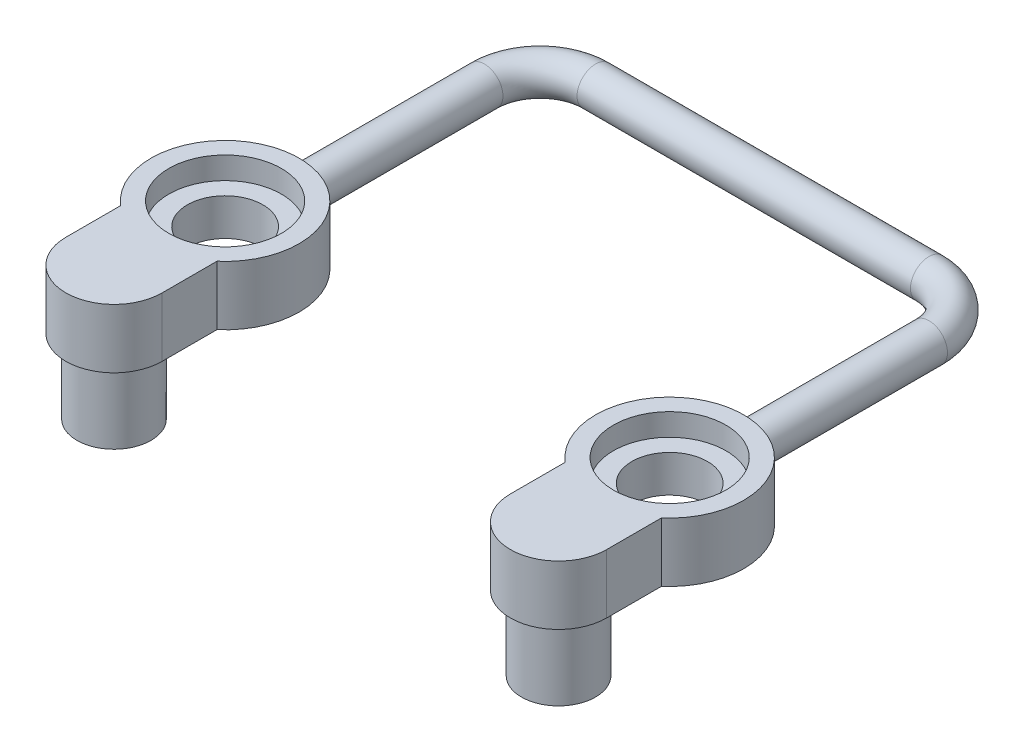
ISO-10303-21;
HEADER;
FILE_DESCRIPTION(('STEP AP214'),'2;1');
FILE_NAME('part.step','',(''),(''),'','','');
FILE_SCHEMA(('AUTOMOTIVE_DESIGN { 1 0 10303 214 1 1 1 1 }'));
ENDSEC;
DATA;
#1=APPLICATION_CONTEXT('core data for automotive mechanical design processes');
#2=APPLICATION_PROTOCOL_DEFINITION('international standard','automotive_design',2000,#1);
#3=PRODUCT_CONTEXT('',#1,'mechanical');
#4=PRODUCT('Part','Part','',(#3));
#5=PRODUCT_RELATED_PRODUCT_CATEGORY('part','',(#4));
#6=PRODUCT_DEFINITION_FORMATION('','',#4);
#7=PRODUCT_DEFINITION_CONTEXT('part definition',#1,'design');
#8=PRODUCT_DEFINITION('design','',#6,#7);
#9=PRODUCT_DEFINITION_SHAPE('','',#8);
#10=(LENGTH_UNIT() NAMED_UNIT(*) SI_UNIT(.MILLI.,.METRE.));
#11=(NAMED_UNIT(*) PLANE_ANGLE_UNIT() SI_UNIT($,.RADIAN.));
#12=(NAMED_UNIT(*) SI_UNIT($,.STERADIAN.) SOLID_ANGLE_UNIT());
#13=UNCERTAINTY_MEASURE_WITH_UNIT(LENGTH_MEASURE(1.E-05),#10,'distance_accuracy_value','');
#14=(GEOMETRIC_REPRESENTATION_CONTEXT(3) GLOBAL_UNCERTAINTY_ASSIGNED_CONTEXT((#13)) GLOBAL_UNIT_ASSIGNED_CONTEXT((#10,
#11,#12)) REPRESENTATION_CONTEXT('',''));
#15=CARTESIAN_POINT('',(0.,0.,0.));
#16=DIRECTION('',(0.,0.,1.));
#17=DIRECTION('',(1.,0.,0.));
#18=AXIS2_PLACEMENT_3D('',#15,#16,#17);
#19=CARTESIAN_POINT('',(38.1,0.,-12.192));
#20=DIRECTION('',(0.,0.,-1.));
#21=DIRECTION('',(-1.,0.,0.));
#22=AXIS2_PLACEMENT_3D('',#19,#20,#21);
#23=CYLINDRICAL_SURFACE('',#22,3.175);
#24=CARTESIAN_POINT('',(38.1,0.,-44.4499999999999));
#25=DIRECTION('',(0.,0.,1.));
#26=DIRECTION('',(1.,0.,0.));
#27=AXIS2_PLACEMENT_3D('',#24,#25,#26);
#28=CIRCLE('',#27,3.175);
#29=CARTESIAN_POINT('',(41.2749999999999,0.,-44.4499999999999));
#30=VERTEX_POINT('',#29);
#31=EDGE_CURVE('E184',#30,#30,#28,.T.);
#32=ORIENTED_EDGE('',*,*,#31,.T.);
#33=EDGE_LOOP('',(#32));
#34=FACE_BOUND('',#33,.T.);
#35=CARTESIAN_POINT('',(34.925,0.,-12.2967221242085));
#36=CARTESIAN_POINT('',(34.9250049801868,-0.175324453676753,-12.2967254711158));
#37=CARTESIAN_POINT('',(34.939571668218,-0.350704021321723,-12.3005126863854));
#38=CARTESIAN_POINT('',(34.997360630661,-0.696426824280357,-12.3152136473056));
#39=CARTESIAN_POINT('',(35.0405995824375,-0.866767068174595,-12.3261315404947));
#40=CARTESIAN_POINT('',(35.1542461764673,-1.19736049349772,-12.3537818023711));
#41=CARTESIAN_POINT('',(35.2246187456248,-1.35762638733985,-12.3705066621688));
#42=CARTESIAN_POINT('',(35.390428150598,-1.66409478272565,-12.4078770387652));
#43=CARTESIAN_POINT('',(35.4858660505279,-1.81029668684188,-12.4285227220068));
#44=CARTESIAN_POINT('',(35.7013402973139,-2.08770428948301,-12.4719170977164));
#45=CARTESIAN_POINT('',(35.8218271526159,-2.21855487244456,-12.4946993898125));
#46=CARTESIAN_POINT('',(36.0830087785922,-2.45841697083763,-12.5395085190442));
#47=CARTESIAN_POINT('',(36.223705436391,-2.56742644453962,-12.5615352853931));
#48=CARTESIAN_POINT('',(36.5237455946297,-2.76196484389172,-12.6027232771114));
#49=CARTESIAN_POINT('',(36.6833218882322,-2.84714491296506,-12.6218402299875));
#50=CARTESIAN_POINT('',(37.0150857559482,-2.98933824807441,-12.65467131146));
#51=CARTESIAN_POINT('',(37.1872714650442,-3.0463556699327,-12.6683862371462));
#52=CARTESIAN_POINT('',(37.5356643763822,-3.1294677499148,-12.6886304373719));
#53=CARTESIAN_POINT('',(37.7117194461728,-3.15616544829476,-12.6952996518228));
#54=CARTESIAN_POINT('',(38.0659273995363,-3.17977314167995,-12.7011886451627));
#55=CARTESIAN_POINT('',(38.2440799690634,-3.17668754070619,-12.7004095254281));
#56=CARTESIAN_POINT('',(38.5932433847723,-3.14124994018231,-12.6915938059099));
#57=CARTESIAN_POINT('',(38.7643249845334,-3.1095488671816,-12.6837186297291));
#58=CARTESIAN_POINT('',(39.0986589355385,-3.0188264870384,-12.6617836238657));
#59=CARTESIAN_POINT('',(39.2619108695012,-2.95980372557068,-12.6477234649603));
#60=CARTESIAN_POINT('',(39.5776662836182,-2.81558673522742,-12.6147513732012));
#61=CARTESIAN_POINT('',(39.7300593185087,-2.73016085327958,-12.5957967501266));
#62=CARTESIAN_POINT('',(40.0185751009311,-2.53573828752235,-12.5550917783831));
#63=CARTESIAN_POINT('',(40.1546950113965,-2.426737502928,-12.5333409435886));
#64=CARTESIAN_POINT('',(40.4106825613947,-2.18476989768239,-12.4887191648708));
#65=CARTESIAN_POINT('',(40.5300106310637,-2.05123428671836,-12.4658338379713));
#66=CARTESIAN_POINT('',(40.7446999936826,-1.76580803360385,-12.42206105267));
#67=CARTESIAN_POINT('',(40.8400601664461,-1.6139165340463,-12.4011736876753));
#68=CARTESIAN_POINT('',(41.0044523096467,-1.29503165663095,-12.3637103097323));
#69=CARTESIAN_POINT('',(41.0733543751312,-1.12796862250274,-12.347155693206));
#70=CARTESIAN_POINT('',(41.1819268455205,-0.78411645554241,-12.3205067298881));
#71=CARTESIAN_POINT('',(41.221603505806,-0.607329412739561,-12.3104110007027));
#72=CARTESIAN_POINT('',(41.2697036411057,-0.254051433057002,-12.2981130212947));
#73=CARTESIAN_POINT('',(41.2789249018773,-0.0776760024568974,-12.295709330007));
#74=CARTESIAN_POINT('',(41.2680365779542,0.274093859463274,-12.2985192607316));
#75=CARTESIAN_POINT('',(41.2479296932692,0.449488379595792,-12.3037321815428));
#76=CARTESIAN_POINT('',(41.1796553392016,0.791355116484689,-12.3209949412092));
#77=CARTESIAN_POINT('',(41.131952366718,0.957926362742883,-12.3329315220801));
#78=CARTESIAN_POINT('',(41.0103549637215,1.28070795147373,-12.3621891219376));
#79=CARTESIAN_POINT('',(40.9364574305949,1.43691706400085,-12.3795107787294));
#80=CARTESIAN_POINT('',(40.7628987482795,1.73792042289096,-12.418010941113));
#81=CARTESIAN_POINT('',(40.6627606273713,1.88243062685459,-12.439258441312));
#82=CARTESIAN_POINT('',(40.4401664300669,2.15288922075787,-12.4830469550031));
#83=CARTESIAN_POINT('',(40.3177066860073,2.27883455414564,-12.5055881806495));
#84=CARTESIAN_POINT('',(40.0502841391265,2.51182002406507,-12.5501070185035));
#85=CARTESIAN_POINT('',(39.9048349492878,2.61830827943698,-12.5720564161859));
#86=CARTESIAN_POINT('',(39.5976560175556,2.80534855102809,-12.6123346509938));
#87=CARTESIAN_POINT('',(39.4359271254404,2.88590192009242,-12.6306636769501));
#88=CARTESIAN_POINT('',(39.1018972904962,3.01808646385047,-12.6615204698767));
#89=CARTESIAN_POINT('',(38.9296826847635,3.06992564116141,-12.6740898412846));
#90=CARTESIAN_POINT('',(38.5786304890122,3.14383462495268,-12.6921932261265));
#91=CARTESIAN_POINT('',(38.3997941840059,3.16591017659858,-12.6977285972964));
#92=CARTESIAN_POINT('',(38.0457598035424,3.17934209690233,-12.7010848787296));
#93=CARTESIAN_POINT('',(37.8705940993829,3.17151292637792,-12.6991103294396));
#94=CARTESIAN_POINT('',(37.5241581988832,3.12722314834044,-12.6881222125238));
#95=CARTESIAN_POINT('',(37.3528878868456,3.09076339233319,-12.6791088542401));
#96=CARTESIAN_POINT('',(37.0199569618278,2.99068420222751,-12.655087493111));
#97=CARTESIAN_POINT('',(36.8582495797058,2.92721203572685,-12.6401120229509));
#98=CARTESIAN_POINT('',(36.5476883565929,2.77504341161286,-12.6057434230086));
#99=CARTESIAN_POINT('',(36.3988361389816,2.68634377427121,-12.5863497364055));
#100=CARTESIAN_POINT('',(36.114348877256,2.48375413206228,-12.5446551773491));
#101=CARTESIAN_POINT('',(35.9791159121528,2.36931154628034,-12.5222957878978));
#102=CARTESIAN_POINT('',(35.7294973106316,2.11955744497192,-12.4774531075658));
#103=CARTESIAN_POINT('',(35.6151169678818,1.98424064634706,-12.4549697867118));
#104=CARTESIAN_POINT('',(35.4083555659519,1.69354050994846,-12.4119473580947));
#105=CARTESIAN_POINT('',(35.316424733353,1.53782990831532,-12.3914523466269));
#106=CARTESIAN_POINT('',(35.1601821033411,1.21267381964745,-12.3553205869608));
#107=CARTESIAN_POINT('',(35.0958502115369,1.04323843265204,-12.3396803064045));
#108=CARTESIAN_POINT('',(35.0062084717871,0.728417987423366,-12.3174731028359));
#109=CARTESIAN_POINT('',(34.9758216833549,0.584539203074018,-12.3097500503611));
#110=CARTESIAN_POINT('',(34.9352162210846,0.293786340932342,-12.2993733749982));
#111=CARTESIAN_POINT('',(34.9249958268697,0.146912519724024,-12.2967193196792));
#112=CARTESIAN_POINT('',(34.925,0.,-12.2967221242085));
#113=B_SPLINE_CURVE_WITH_KNOTS('',3,(#35,#36,#37,#38,#39,#40,#41,#42,#43,#44,#45,#46,#47,#48,
#49,#50,#51,#52,#53,#54,#55,#56,#57,#58,#59,#60,#61,#62,#63,#64,#65,#66,#67,#68,#69,#70,#71,#72,
#73,#74,#75,#76,#77,#78,#79,#80,#81,#82,#83,#84,#85,#86,#87,#88,#89,#90,#91,#92,#93,#94,#95,#96,
#97,#98,#99,#100,#101,#102,#103,#104,#105,#106,#107,#108,#109,#110,#111,#112),.UNSPECIFIED.,.T.,
.F.,(4,2,2,2,2,2,2,2,2,2,2,2,2,2,2,2,2,2,2,2,2,2,2,2,2,2,2,2,2,2,2,2,2,2,2,2,2,2,4),(0.,
0.525433851004893,1.05117359161441,1.57623602350085,2.10132074979458,2.6368242182508,
3.1723777227943,3.71540400425358,4.25835013005807,4.7902971376409,5.32216548805846,
5.84223193614963,6.36232607040478,6.88711950303144,7.41200429545519,7.95109492546326,
8.49021074623747,9.0319406865067,9.57355464164525,10.1008633995054,10.6281236152971,
11.1467570436797,11.6654519221148,12.1943221424741,12.7232793399029,13.2654717033223,
13.8076357797011,14.3458193247108,14.8838989712076,15.4074297658815,15.9309449907504,
16.4516419323711,16.9724045329363,17.5056431266551,18.0390169009447,18.5823412615974,
19.1252693614627,19.5655924052587,20.0058778838705),.UNSPECIFIED.);
#114=CARTESIAN_POINT('',(34.925,0.,-12.2967221242085));
#115=VERTEX_POINT('',#114);
#116=EDGE_CURVE('E11',#115,#115,#113,.T.);
#117=ORIENTED_EDGE('',*,*,#116,.F.);
#118=EDGE_LOOP('',(#117));
#119=FACE_BOUND('',#118,.T.);
#120=ADVANCED_FACE('F45',(#34,#119),#23,.T.);
#121=CARTESIAN_POINT('',(-38.1,5.08,0.));
#122=DIRECTION('',(0.,-1.,0.));
#123=DIRECTION('',(0.,0.,-1.));
#124=AXIS2_PLACEMENT_3D('',#121,#122,#123);
#125=CYLINDRICAL_SURFACE('',#124,12.7);
#126=CARTESIAN_POINT('',(-38.1,-5.08,0.));
#127=DIRECTION('',(0.,1.,0.));
#128=DIRECTION('',(0.,0.,1.));
#129=AXIS2_PLACEMENT_3D('',#126,#127,#128);
#130=CIRCLE('',#129,12.7);
#131=CARTESIAN_POINT('',(-29.845,-5.08,9.65116443751737));
#132=VERTEX_POINT('',#131);
#133=CARTESIAN_POINT('',(-46.355,-5.08,9.65116443751737));
#134=VERTEX_POINT('',#133);
#135=EDGE_CURVE('E86',#132,#134,#130,.T.);
#136=ORIENTED_EDGE('',*,*,#135,.T.);
#137=DIRECTION('',(0.,-1.,0.));
#138=VECTOR('',#137,1.);
#139=CARTESIAN_POINT('',(-46.355,5.08,9.65116443751737));
#140=LINE('',#139,#138);
#141=CARTESIAN_POINT('',(-46.355,5.08,9.65116443751737));
#142=VERTEX_POINT('',#141);
#143=EDGE_CURVE('E246',#142,#134,#140,.T.);
#144=ORIENTED_EDGE('',*,*,#143,.F.);
#145=CARTESIAN_POINT('',(-38.1,5.08,0.));
#146=DIRECTION('',(0.,1.,0.));
#147=DIRECTION('',(0.,0.,1.));
#148=AXIS2_PLACEMENT_3D('',#145,#146,#147);
#149=CIRCLE('',#148,12.7);
#150=CARTESIAN_POINT('',(-29.845,5.08,9.65116443751737));
#151=VERTEX_POINT('',#150);
#152=EDGE_CURVE('E228',#151,#142,#149,.T.);
#153=ORIENTED_EDGE('',*,*,#152,.F.);
#154=DIRECTION('',(0.,-1.,0.));
#155=VECTOR('',#154,1.);
#156=CARTESIAN_POINT('',(-29.845,5.08,9.65116443751737));
#157=LINE('',#156,#155);
#158=EDGE_CURVE('E249',#151,#132,#157,.T.);
#159=ORIENTED_EDGE('',*,*,#158,.T.);
#160=EDGE_LOOP('',(#136,#144,#153,#159));
#161=FACE_BOUND('',#160,.T.);
#162=CARTESIAN_POINT('',(-34.925,0.,-12.2967221242085));
#163=CARTESIAN_POINT('',(-34.9250049801868,-0.175324453676753,-12.2967254711158));
#164=CARTESIAN_POINT('',(-34.939571668218,-0.350704021321724,-12.3005126863854));
#165=CARTESIAN_POINT('',(-34.997360630661,-0.696426824280357,-12.3152136473056));
#166=CARTESIAN_POINT('',(-35.0405995824375,-0.866767068174595,-12.3261315404947));
#167=CARTESIAN_POINT('',(-35.1542461764673,-1.19736049349772,-12.3537818023711));
#168=CARTESIAN_POINT('',(-35.2246187456248,-1.35762638733985,-12.3705066621688));
#169=CARTESIAN_POINT('',(-35.390428150598,-1.66409478272565,-12.4078770387652));
#170=CARTESIAN_POINT('',(-35.4858660505279,-1.81029668684188,-12.4285227220068));
#171=CARTESIAN_POINT('',(-35.7013402973139,-2.08770428948301,-12.4719170977164));
#172=CARTESIAN_POINT('',(-35.8218271526159,-2.21855487244456,-12.4946993898125));
#173=CARTESIAN_POINT('',(-36.0830087785922,-2.45841697083763,-12.5395085190442));
#174=CARTESIAN_POINT('',(-36.223705436391,-2.56742644453962,-12.5615352853931));
#175=CARTESIAN_POINT('',(-36.5237455946297,-2.76196484389172,-12.6027232771114));
#176=CARTESIAN_POINT('',(-36.6833218882322,-2.84714491296506,-12.6218402299875));
#177=CARTESIAN_POINT('',(-37.0150857559482,-2.98933824807441,-12.65467131146));
#178=CARTESIAN_POINT('',(-37.1872714650442,-3.0463556699327,-12.6683862371462));
#179=CARTESIAN_POINT('',(-37.5356643763822,-3.1294677499148,-12.6886304373719));
#180=CARTESIAN_POINT('',(-37.7117194461728,-3.15616544829476,-12.6952996518228));
#181=CARTESIAN_POINT('',(-38.0659273995363,-3.17977314167995,-12.7011886451627));
#182=CARTESIAN_POINT('',(-38.2440799690634,-3.17668754070619,-12.7004095254281));
#183=CARTESIAN_POINT('',(-38.5932433847723,-3.14124994018231,-12.6915938059099));
#184=CARTESIAN_POINT('',(-38.7643249845334,-3.1095488671816,-12.6837186297291));
#185=CARTESIAN_POINT('',(-39.0986589355385,-3.0188264870384,-12.6617836238657));
#186=CARTESIAN_POINT('',(-39.2619108695012,-2.95980372557068,-12.6477234649603));
#187=CARTESIAN_POINT('',(-39.5776662836182,-2.81558673522742,-12.6147513732012));
#188=CARTESIAN_POINT('',(-39.7300593185087,-2.73016085327958,-12.5957967501266));
#189=CARTESIAN_POINT('',(-40.0185751009311,-2.53573828752235,-12.5550917783831));
#190=CARTESIAN_POINT('',(-40.1546950113965,-2.426737502928,-12.5333409435886));
#191=CARTESIAN_POINT('',(-40.4106825613947,-2.18476989768239,-12.4887191648708));
#192=CARTESIAN_POINT('',(-40.5300106310637,-2.05123428671836,-12.4658338379713));
#193=CARTESIAN_POINT('',(-40.7446999936826,-1.76580803360384,-12.42206105267));
#194=CARTESIAN_POINT('',(-40.8400601664461,-1.61391653404629,-12.4011736876753));
#195=CARTESIAN_POINT('',(-41.0044523096467,-1.29503165663094,-12.3637103097323));
#196=CARTESIAN_POINT('',(-41.0733543751312,-1.12796862250273,-12.347155693206));
#197=CARTESIAN_POINT('',(-41.1819268455205,-0.784116455542407,-12.3205067298881));
#198=CARTESIAN_POINT('',(-41.221603505806,-0.607329412739561,-12.3104110007027));
#199=CARTESIAN_POINT('',(-41.2697036411057,-0.254051433057003,-12.2981130212947));
#200=CARTESIAN_POINT('',(-41.2789249018773,-0.0776760024568989,-12.2957093300071));
#201=CARTESIAN_POINT('',(-41.2680365779542,0.274093859463274,-12.2985192607316));
#202=CARTESIAN_POINT('',(-41.2479296932692,0.449488379595792,-12.3037321815428));
#203=CARTESIAN_POINT('',(-41.1796553392016,0.79135511648469,-12.3209949412092));
#204=CARTESIAN_POINT('',(-41.131952366718,0.957926362742884,-12.3329315220801));
#205=CARTESIAN_POINT('',(-41.0103549637215,1.28070795147373,-12.3621891219376));
#206=CARTESIAN_POINT('',(-40.9364574305949,1.43691706400085,-12.3795107787294));
#207=CARTESIAN_POINT('',(-40.7628987482795,1.73792042289096,-12.418010941113));
#208=CARTESIAN_POINT('',(-40.6627606273713,1.88243062685459,-12.439258441312));
#209=CARTESIAN_POINT('',(-40.4401664300669,2.15288922075787,-12.4830469550031));
#210=CARTESIAN_POINT('',(-40.3177066860073,2.27883455414564,-12.5055881806495));
#211=CARTESIAN_POINT('',(-40.0502841391265,2.51182002406507,-12.5501070185035));
#212=CARTESIAN_POINT('',(-39.9048349492878,2.61830827943698,-12.5720564161859));
#213=CARTESIAN_POINT('',(-39.5976560175556,2.80534855102809,-12.6123346509939));
#214=CARTESIAN_POINT('',(-39.4359271254404,2.88590192009242,-12.6306636769502));
#215=CARTESIAN_POINT('',(-39.1018972904962,3.01808646385047,-12.6615204698767));
#216=CARTESIAN_POINT('',(-38.9296826847635,3.06992564116141,-12.6740898412846));
#217=CARTESIAN_POINT('',(-38.5786304890122,3.14383462495268,-12.6921932261265));
#218=CARTESIAN_POINT('',(-38.3997941840059,3.16591017659858,-12.6977285972965));
#219=CARTESIAN_POINT('',(-38.0457598035424,3.17934209690233,-12.7010848787296));
#220=CARTESIAN_POINT('',(-37.8705940993829,3.17151292637792,-12.6991103294396));
#221=CARTESIAN_POINT('',(-37.5241581988832,3.12722314834044,-12.6881222125238));
#222=CARTESIAN_POINT('',(-37.3528878868456,3.09076339233319,-12.6791088542401));
#223=CARTESIAN_POINT('',(-37.0199569618278,2.99068420222751,-12.655087493111));
#224=CARTESIAN_POINT('',(-36.8582495797058,2.92721203572685,-12.640112022951));
#225=CARTESIAN_POINT('',(-36.5476883565929,2.77504341161286,-12.6057434230086));
#226=CARTESIAN_POINT('',(-36.3988361389816,2.68634377427121,-12.5863497364055));
#227=CARTESIAN_POINT('',(-36.114348877256,2.48375413206228,-12.5446551773491));
#228=CARTESIAN_POINT('',(-35.9791159121528,2.36931154628034,-12.5222957878978));
#229=CARTESIAN_POINT('',(-35.7294973106316,2.11955744497192,-12.4774531075658));
#230=CARTESIAN_POINT('',(-35.6151169678818,1.98424064634706,-12.4549697867118));
#231=CARTESIAN_POINT('',(-35.4083555659519,1.69354050994846,-12.4119473580947));
#232=CARTESIAN_POINT('',(-35.316424733353,1.53782990831532,-12.3914523466269));
#233=CARTESIAN_POINT('',(-35.1601821033411,1.21267381964745,-12.3553205869608));
#234=CARTESIAN_POINT('',(-35.0958502115369,1.04323843265204,-12.3396803064045));
#235=CARTESIAN_POINT('',(-35.0062084717871,0.728417987423365,-12.3174731028359));
#236=CARTESIAN_POINT('',(-34.9758216833549,0.584539203074016,-12.3097500503611));
#237=CARTESIAN_POINT('',(-34.9352162210846,0.293786340932341,-12.2993733749982));
#238=CARTESIAN_POINT('',(-34.9249958268697,0.146912519724023,-12.2967193196792));
#239=CARTESIAN_POINT('',(-34.925,0.,-12.2967221242085));
#240=B_SPLINE_CURVE_WITH_KNOTS('',3,(#162,#163,#164,#165,#166,#167,#168,#169,#170,#171,#172,
#173,#174,#175,#176,#177,#178,#179,#180,#181,#182,#183,#184,#185,#186,#187,#188,#189,#190,#191,
#192,#193,#194,#195,#196,#197,#198,#199,#200,#201,#202,#203,#204,#205,#206,#207,#208,#209,#210,
#211,#212,#213,#214,#215,#216,#217,#218,#219,#220,#221,#222,#223,#224,#225,#226,#227,#228,#229,
#230,#231,#232,#233,#234,#235,#236,#237,#238,#239),.UNSPECIFIED.,.T.,.F.,(4,2,2,2,2,2,2,2,2,2,2,
2,2,2,2,2,2,2,2,2,2,2,2,2,2,2,2,2,2,2,2,2,2,2,2,2,2,2,4),(0.,0.525433851004893,1.05117359161441,
1.57623602350085,2.10132074979458,2.6368242182508,3.1723777227943,3.71540400425358,
4.25835013005807,4.7902971376409,5.32216548805846,5.84223193614963,6.36232607040478,
6.88711950303145,7.41200429545519,7.95109492546327,8.49021074623748,9.0319406865067,
9.57355464164524,10.1008633995054,10.6281236152971,11.1467570436797,11.6654519221148,
12.1943221424741,12.7232793399029,13.2654717033223,13.8076357797011,14.3458193247108,
14.8838989712076,15.4074297658815,15.9309449907504,16.4516419323711,16.9724045329363,
17.5056431266551,18.0390169009447,18.5823412615974,19.1252693614627,19.5655924052587,
20.0058778838705),.UNSPECIFIED.);
#241=CARTESIAN_POINT('',(-34.925,0.,-12.2967221242085));
#242=VERTEX_POINT('',#241);
#243=EDGE_CURVE('E60',#242,#242,#240,.T.);
#244=ORIENTED_EDGE('',*,*,#243,.F.);
#245=EDGE_LOOP('',(#244));
#246=FACE_BOUND('',#245,.T.);
#247=ADVANCED_FACE('F263',(#161,#246),#125,.T.);
#248=CARTESIAN_POINT('',(-38.1,5.08,0.));
#249=DIRECTION('',(0.,-1.,0.));
#250=DIRECTION('',(0.,0.,-1.));
#251=AXIS2_PLACEMENT_3D('',#248,#249,#250);
#252=CYLINDRICAL_SURFACE('',#251,6.477);
#253=CARTESIAN_POINT('',(-38.1,-5.08,0.));
#254=DIRECTION('',(0.,1.,0.));
#255=DIRECTION('',(0.,0.,1.));
#256=AXIS2_PLACEMENT_3D('',#253,#254,#255);
#257=CIRCLE('',#256,6.477);
#258=CARTESIAN_POINT('',(-38.1,-5.08,6.477));
#259=VERTEX_POINT('',#258);
#260=EDGE_CURVE('E213',#259,#259,#257,.T.);
#261=ORIENTED_EDGE('',*,*,#260,.F.);
#262=EDGE_LOOP('',(#261));
#263=FACE_BOUND('',#262,.T.);
#264=CARTESIAN_POINT('',(-38.1,1.27,0.));
#265=DIRECTION('',(0.,1.,0.));
#266=DIRECTION('',(0.,0.,1.));
#267=AXIS2_PLACEMENT_3D('',#264,#265,#266);
#268=CIRCLE('',#267,6.477);
#269=CARTESIAN_POINT('',(-38.1,1.27,6.477));
#270=VERTEX_POINT('',#269);
#271=EDGE_CURVE('E205',#270,#270,#268,.T.);
#272=ORIENTED_EDGE('',*,*,#271,.T.);
#273=EDGE_LOOP('',(#272));
#274=FACE_BOUND('',#273,.T.);
#275=ADVANCED_FACE('F292',(#263,#274),#252,.F.);
#276=CARTESIAN_POINT('',(-38.1,5.08,19.05));
#277=DIRECTION('',(0.,1.,0.));
#278=DIRECTION('',(0.,0.,1.));
#279=AXIS2_PLACEMENT_3D('',#276,#277,#278);
#280=PLANE('',#279);
#281=CARTESIAN_POINT('',(-38.1,5.08,0.));
#282=DIRECTION('',(0.,1.,0.));
#283=DIRECTION('',(0.,0.,1.));
#284=AXIS2_PLACEMENT_3D('',#281,#282,#283);
#285=CIRCLE('',#284,9.652);
#286=CARTESIAN_POINT('',(-38.1,5.08,9.652));
#287=VERTEX_POINT('',#286);
#288=EDGE_CURVE('E200',#287,#287,#285,.T.);
#289=ORIENTED_EDGE('',*,*,#288,.F.);
#290=EDGE_LOOP('',(#289));
#291=FACE_BOUND('',#290,.T.);
#292=CARTESIAN_POINT('',(-38.1,5.08,19.05));
#293=DIRECTION('',(0.,1.,0.));
#294=DIRECTION('',(0.,0.,1.));
#295=AXIS2_PLACEMENT_3D('',#292,#293,#294);
#296=CIRCLE('',#295,8.255);
#297=CARTESIAN_POINT('',(-46.355,5.08,19.05));
#298=VERTEX_POINT('',#297);
#299=CARTESIAN_POINT('',(-29.845,5.08,19.05));
#300=VERTEX_POINT('',#299);
#301=EDGE_CURVE('E223',#298,#300,#296,.T.);
#302=ORIENTED_EDGE('',*,*,#301,.T.);
#303=DIRECTION('',(0.,0.,-1.));
#304=VECTOR('',#303,1.);
#305=CARTESIAN_POINT('',(-29.845,5.08,19.05));
#306=LINE('',#305,#304);
#307=EDGE_CURVE('E100',#300,#151,#306,.T.);
#308=ORIENTED_EDGE('',*,*,#307,.T.);
#309=ORIENTED_EDGE('',*,*,#152,.T.);
#310=DIRECTION('',(0.,0.,1.));
#311=VECTOR('',#310,1.);
#312=CARTESIAN_POINT('',(-46.355,5.08,19.05));
#313=LINE('',#312,#311);
#314=EDGE_CURVE('E68',#142,#298,#313,.T.);
#315=ORIENTED_EDGE('',*,*,#314,.T.);
#316=EDGE_LOOP('',(#302,#308,#309,#315));
#317=FACE_BOUND('',#316,.T.);
#318=ADVANCED_FACE('F295',(#291,#317),#280,.T.);
#319=CARTESIAN_POINT('',(-38.1,-5.08,19.05));
#320=DIRECTION('',(0.,1.,0.));
#321=DIRECTION('',(0.,0.,1.));
#322=AXIS2_PLACEMENT_3D('',#319,#320,#321);
#323=PLANE('',#322);
#324=CARTESIAN_POINT('',(-38.1,-5.08,19.05));
#325=DIRECTION('',(0.,-1.,0.));
#326=DIRECTION('',(0.,0.,-1.));
#327=AXIS2_PLACEMENT_3D('',#324,#325,#326);
#328=CIRCLE('',#327,6.35);
#329=CARTESIAN_POINT('',(-38.1,-5.08,12.7));
#330=VERTEX_POINT('',#329);
#331=EDGE_CURVE('E214',#330,#330,#328,.T.);
#332=ORIENTED_EDGE('',*,*,#331,.F.);
#333=EDGE_LOOP('',(#332));
#334=FACE_BOUND('',#333,.T.);
#335=CARTESIAN_POINT('',(-38.1,-5.08,19.05));
#336=DIRECTION('',(0.,1.,0.));
#337=DIRECTION('',(0.,0.,1.));
#338=AXIS2_PLACEMENT_3D('',#335,#336,#337);
#339=CIRCLE('',#338,8.255);
#340=CARTESIAN_POINT('',(-46.355,-5.08,19.05));
#341=VERTEX_POINT('',#340);
#342=CARTESIAN_POINT('',(-29.845,-5.08,19.05));
#343=VERTEX_POINT('',#342);
#344=EDGE_CURVE('E222',#341,#343,#339,.T.);
#345=ORIENTED_EDGE('',*,*,#344,.F.);
#346=DIRECTION('',(0.,0.,1.));
#347=VECTOR('',#346,1.);
#348=CARTESIAN_POINT('',(-46.355,-5.08,19.05));
#349=LINE('',#348,#347);
#350=EDGE_CURVE('E92',#134,#341,#349,.T.);
#351=ORIENTED_EDGE('',*,*,#350,.F.);
#352=ORIENTED_EDGE('',*,*,#135,.F.);
#353=DIRECTION('',(0.,0.,-1.));
#354=VECTOR('',#353,1.);
#355=CARTESIAN_POINT('',(-29.845,-5.08,19.05));
#356=LINE('',#355,#354);
#357=EDGE_CURVE('E237',#343,#132,#356,.T.);
#358=ORIENTED_EDGE('',*,*,#357,.F.);
#359=EDGE_LOOP('',(#345,#351,#352,#358));
#360=FACE_BOUND('',#359,.T.);
#361=ORIENTED_EDGE('',*,*,#260,.T.);
#362=EDGE_LOOP('',(#361));
#363=FACE_BOUND('',#362,.T.);
#364=ADVANCED_FACE('F299',(#334,#360,#363),#323,.F.);
#365=CARTESIAN_POINT('',(-38.1,5.08,19.05));
#366=DIRECTION('',(0.,-1.,0.));
#367=DIRECTION('',(0.,0.,-1.));
#368=AXIS2_PLACEMENT_3D('',#365,#366,#367);
#369=CYLINDRICAL_SURFACE('',#368,8.255);
#370=ORIENTED_EDGE('',*,*,#344,.T.);
#371=DIRECTION('',(0.,-1.,0.));
#372=VECTOR('',#371,1.);
#373=CARTESIAN_POINT('',(-29.845,5.08,19.05));
#374=LINE('',#373,#372);
#375=EDGE_CURVE('E218',#300,#343,#374,.T.);
#376=ORIENTED_EDGE('',*,*,#375,.F.);
#377=ORIENTED_EDGE('',*,*,#301,.F.);
#378=DIRECTION('',(0.,-1.,0.));
#379=VECTOR('',#378,1.);
#380=CARTESIAN_POINT('',(-46.355,5.08,19.05));
#381=LINE('',#380,#379);
#382=EDGE_CURVE('E233',#298,#341,#381,.T.);
#383=ORIENTED_EDGE('',*,*,#382,.T.);
#384=EDGE_LOOP('',(#370,#376,#377,#383));
#385=FACE_BOUND('',#384,.T.);
#386=ADVANCED_FACE('F47',(#385),#369,.T.);
#387=CARTESIAN_POINT('',(-29.845,5.08,19.05));
#388=DIRECTION('',(-1.,0.,0.));
#389=DIRECTION('',(0.,0.,1.));
#390=AXIS2_PLACEMENT_3D('',#387,#388,#389);
#391=PLANE('',#390);
#392=ORIENTED_EDGE('',*,*,#357,.T.);
#393=ORIENTED_EDGE('',*,*,#158,.F.);
#394=ORIENTED_EDGE('',*,*,#307,.F.);
#395=ORIENTED_EDGE('',*,*,#375,.T.);
#396=EDGE_LOOP('',(#392,#393,#394,#395));
#397=FACE_BOUND('',#396,.T.);
#398=ADVANCED_FACE('F304',(#397),#391,.F.);
#399=CARTESIAN_POINT('',(-46.355,5.08,19.05));
#400=DIRECTION('',(1.,0.,0.));
#401=DIRECTION('',(0.,0.,-1.));
#402=AXIS2_PLACEMENT_3D('',#399,#400,#401);
#403=PLANE('',#402);
#404=ORIENTED_EDGE('',*,*,#350,.T.);
#405=ORIENTED_EDGE('',*,*,#382,.F.);
#406=ORIENTED_EDGE('',*,*,#314,.F.);
#407=ORIENTED_EDGE('',*,*,#143,.T.);
#408=EDGE_LOOP('',(#404,#405,#406,#407));
#409=FACE_BOUND('',#408,.T.);
#410=ADVANCED_FACE('F290',(#409),#403,.F.);
#411=CARTESIAN_POINT('',(-38.1,-17.78,19.05));
#412=DIRECTION('',(0.,1.,0.));
#413=DIRECTION('',(0.,0.,1.));
#414=AXIS2_PLACEMENT_3D('',#411,#412,#413);
#415=CYLINDRICAL_SURFACE('',#414,6.35);
#416=CARTESIAN_POINT('',(-38.1,-17.78,19.05));
#417=DIRECTION('',(0.,-1.,0.));
#418=DIRECTION('',(0.,0.,-1.));
#419=AXIS2_PLACEMENT_3D('',#416,#417,#418);
#420=CIRCLE('',#419,6.35);
#421=CARTESIAN_POINT('',(-38.1,-17.78,12.7));
#422=VERTEX_POINT('',#421);
#423=EDGE_CURVE('E209',#422,#422,#420,.T.);
#424=ORIENTED_EDGE('',*,*,#423,.F.);
#425=EDGE_LOOP('',(#424));
#426=FACE_BOUND('',#425,.T.);
#427=ORIENTED_EDGE('',*,*,#331,.T.);
#428=EDGE_LOOP('',(#427));
#429=FACE_BOUND('',#428,.T.);
#430=ADVANCED_FACE('F286',(#426,#429),#415,.T.);
#431=CARTESIAN_POINT('',(-38.1,-17.78,19.05));
#432=DIRECTION('',(0.,-1.,0.));
#433=DIRECTION('',(0.,0.,-1.));
#434=AXIS2_PLACEMENT_3D('',#431,#432,#433);
#435=PLANE('',#434);
#436=ORIENTED_EDGE('',*,*,#423,.T.);
#437=EDGE_LOOP('',(#436));
#438=FACE_BOUND('',#437,.T.);
#439=ADVANCED_FACE('F282',(#438),#435,.T.);
#440=CARTESIAN_POINT('',(-38.1,1.27,0.));
#441=DIRECTION('',(0.,1.,0.));
#442=DIRECTION('',(0.,0.,1.));
#443=AXIS2_PLACEMENT_3D('',#440,#441,#442);
#444=CYLINDRICAL_SURFACE('',#443,9.652);
#445=CARTESIAN_POINT('',(-38.1,1.27,0.));
#446=DIRECTION('',(0.,1.,0.));
#447=DIRECTION('',(0.,0.,1.));
#448=AXIS2_PLACEMENT_3D('',#445,#446,#447);
#449=CIRCLE('',#448,9.652);
#450=CARTESIAN_POINT('',(-38.1,1.27,9.652));
#451=VERTEX_POINT('',#450);
#452=EDGE_CURVE('E201',#451,#451,#449,.T.);
#453=CARTESIAN_POINT('',(-38.1,1.27,9.652));
#454=CARTESIAN_POINT('',(-38.1,1.3096875,9.652));
#455=CARTESIAN_POINT('',(-38.1,1.349375,9.652));
#456=CARTESIAN_POINT('',(-38.1,1.42875,9.652));
#457=CARTESIAN_POINT('',(-38.1,1.4684375,9.652));
#458=CARTESIAN_POINT('',(-38.1,1.5478125,9.652));
#459=CARTESIAN_POINT('',(-38.1,1.5875,9.652));
#460=CARTESIAN_POINT('',(-38.1,1.666875,9.652));
#461=CARTESIAN_POINT('',(-38.1,1.7065625,9.652));
#462=CARTESIAN_POINT('',(-38.1,1.7859375,9.652));
#463=CARTESIAN_POINT('',(-38.1,1.825625,9.652));
#464=CARTESIAN_POINT('',(-38.1,1.905,9.652));
#465=CARTESIAN_POINT('',(-38.1,1.9446875,9.652));
#466=CARTESIAN_POINT('',(-38.1,2.0240625,9.652));
#467=CARTESIAN_POINT('',(-38.1,2.06375,9.652));
#468=CARTESIAN_POINT('',(-38.1,2.143125,9.652));
#469=CARTESIAN_POINT('',(-38.1,2.1828125,9.652));
#470=CARTESIAN_POINT('',(-38.1,2.2621875,9.652));
#471=CARTESIAN_POINT('',(-38.1,2.301875,9.652));
#472=CARTESIAN_POINT('',(-38.1,2.38125,9.652));
#473=CARTESIAN_POINT('',(-38.1,2.4209375,9.652));
#474=CARTESIAN_POINT('',(-38.1,2.5003125,9.652));
#475=CARTESIAN_POINT('',(-38.1,2.54,9.652));
#476=CARTESIAN_POINT('',(-38.1,2.619375,9.652));
#477=CARTESIAN_POINT('',(-38.1,2.6590625,9.652));
#478=CARTESIAN_POINT('',(-38.1,2.7384375,9.652));
#479=CARTESIAN_POINT('',(-38.1,2.778125,9.652));
#480=CARTESIAN_POINT('',(-38.1,2.8575,9.652));
#481=CARTESIAN_POINT('',(-38.1,2.8971875,9.652));
#482=CARTESIAN_POINT('',(-38.1,2.9765625,9.652));
#483=CARTESIAN_POINT('',(-38.1,3.01625,9.652));
#484=CARTESIAN_POINT('',(-38.1,3.095625,9.652));
#485=CARTESIAN_POINT('',(-38.1,3.1353125,9.652));
#486=CARTESIAN_POINT('',(-38.1,3.2146875,9.652));
#487=CARTESIAN_POINT('',(-38.1,3.254375,9.652));
#488=CARTESIAN_POINT('',(-38.1,3.33375,9.652));
#489=CARTESIAN_POINT('',(-38.1,3.3734375,9.652));
#490=CARTESIAN_POINT('',(-38.1,3.4528125,9.652));
#491=CARTESIAN_POINT('',(-38.1,3.4925,9.652));
#492=CARTESIAN_POINT('',(-38.1,3.571875,9.652));
#493=CARTESIAN_POINT('',(-38.1,3.6115625,9.652));
#494=CARTESIAN_POINT('',(-38.1,3.6909375,9.652));
#495=CARTESIAN_POINT('',(-38.1,3.730625,9.652));
#496=CARTESIAN_POINT('',(-38.1,3.81,9.652));
#497=CARTESIAN_POINT('',(-38.1,3.8496875,9.652));
#498=CARTESIAN_POINT('',(-38.1,3.9290625,9.652));
#499=CARTESIAN_POINT('',(-38.1,3.96875,9.652));
#500=CARTESIAN_POINT('',(-38.1,4.048125,9.652));
#501=CARTESIAN_POINT('',(-38.1,4.0878125,9.652));
#502=CARTESIAN_POINT('',(-38.1,4.1671875,9.652));
#503=CARTESIAN_POINT('',(-38.1,4.206875,9.652));
#504=CARTESIAN_POINT('',(-38.1,4.28625,9.652));
#505=CARTESIAN_POINT('',(-38.1,4.3259375,9.652));
#506=CARTESIAN_POINT('',(-38.1,4.4053125,9.652));
#507=CARTESIAN_POINT('',(-38.1,4.445,9.652));
#508=CARTESIAN_POINT('',(-38.1,4.524375,9.652));
#509=CARTESIAN_POINT('',(-38.1,4.5640625,9.652));
#510=CARTESIAN_POINT('',(-38.1,4.6434375,9.652));
#511=CARTESIAN_POINT('',(-38.1,4.683125,9.652));
#512=CARTESIAN_POINT('',(-38.1,4.7625,9.652));
#513=CARTESIAN_POINT('',(-38.1,4.8021875,9.652));
#514=CARTESIAN_POINT('',(-38.1,4.8815625,9.652));
#515=CARTESIAN_POINT('',(-38.1,4.92125,9.652));
#516=CARTESIAN_POINT('',(-38.1,5.000625,9.652));
#517=CARTESIAN_POINT('',(-38.1,5.0403125,9.652));
#518=CARTESIAN_POINT('',(-38.1,5.08,9.652));
#519=B_SPLINE_CURVE_WITH_KNOTS('',3,(#453,#454,#455,#456,#457,#458,#459,#460,#461,#462,#463,
#464,#465,#466,#467,#468,#469,#470,#471,#472,#473,#474,#475,#476,#477,#478,#479,#480,#481,#482,
#483,#484,#485,#486,#487,#488,#489,#490,#491,#492,#493,#494,#495,#496,#497,#498,#499,#500,#501,
#502,#503,#504,#505,#506,#507,#508,#509,#510,#511,#512,#513,#514,#515,#516,#517,#518),
.UNSPECIFIED.,.F.,.F.,(4,2,2,2,2,2,2,2,2,2,2,2,2,2,2,2,2,2,2,2,2,2,2,2,2,2,2,2,2,2,2,2,4),(0.,
0.1190625,0.238125,0.3571875,0.47625,0.5953125,0.714375,0.833437499999999,0.9525,1.0715625,
1.190625,1.3096875,1.42875,1.5478125,1.666875,1.7859375,1.905,2.0240625,2.143125,2.2621875,
2.38125,2.5003125,2.619375,2.7384375,2.8575,2.9765625,3.095625,3.2146875,3.33375,3.4528125,
3.571875,3.6909375,3.81),.UNSPECIFIED.);
#520=EDGE_CURVE('BSEAM278',#451,#287,#519,.T.);
#521=ORIENTED_EDGE('',*,*,#452,.F.);
#522=ORIENTED_EDGE('',*,*,#288,.T.);
#523=ORIENTED_EDGE('',*,*,#520,.T.);
#524=ORIENTED_EDGE('',*,*,#520,.F.);
#525=EDGE_LOOP('',(#521,#523,#522,#524));
#526=FACE_BOUND('',#525,.T.);
#527=ADVANCED_FACE('F278',(#526),#444,.F.);
#528=CARTESIAN_POINT('',(-38.1,1.27,0.));
#529=DIRECTION('',(0.,1.,0.));
#530=DIRECTION('',(0.,0.,1.));
#531=AXIS2_PLACEMENT_3D('',#528,#529,#530);
#532=PLANE('',#531);
#533=ORIENTED_EDGE('',*,*,#271,.F.);
#534=EDGE_LOOP('',(#533));
#535=FACE_BOUND('',#534,.T.);
#536=ORIENTED_EDGE('',*,*,#452,.T.);
#537=EDGE_LOOP('',(#536));
#538=FACE_BOUND('',#537,.T.);
#539=ADVANCED_FACE('F272',(#535,#538),#532,.T.);
#540=CARTESIAN_POINT('',(-38.1,0.,-44.4499999999999));
#541=DIRECTION('',(0.,0.,1.));
#542=DIRECTION('',(1.,0.,0.));
#543=AXIS2_PLACEMENT_3D('',#540,#541,#542);
#544=CYLINDRICAL_SURFACE('',#543,3.175);
#545=CARTESIAN_POINT('',(-38.1,0.,-44.4499999999999));
#546=DIRECTION('',(0.,0.,-1.));
#547=DIRECTION('',(-1.,0.,0.));
#548=AXIS2_PLACEMENT_3D('',#545,#546,#547);
#549=CIRCLE('',#548,3.175);
#550=CARTESIAN_POINT('',(-41.275,0.,-44.4499999999999));
#551=VERTEX_POINT('',#550);
#552=EDGE_CURVE('E196',#551,#551,#549,.T.);
#553=ORIENTED_EDGE('',*,*,#552,.F.);
#554=EDGE_LOOP('',(#553));
#555=FACE_BOUND('',#554,.T.);
#556=ORIENTED_EDGE('',*,*,#243,.T.);
#557=EDGE_LOOP('',(#556));
#558=FACE_BOUND('',#557,.T.);
#559=ADVANCED_FACE('F266',(#555,#558),#544,.T.);
#560=CARTESIAN_POINT('',(28.575,0.,-44.45));
#561=DIRECTION('',(0.,1.,0.));
#562=DIRECTION('',(0.,0.,1.));
#563=AXIS2_PLACEMENT_3D('',#560,#561,#562);
#564=TOROIDAL_SURFACE('',#563,9.52499999999991,3.175);
#565=CARTESIAN_POINT('',(28.5749999999999,0.,-53.975));
#566=DIRECTION('',(1.,0.,0.));
#567=DIRECTION('',(0.,0.,-1.));
#568=AXIS2_PLACEMENT_3D('',#565,#566,#567);
#569=CIRCLE('',#568,3.175);
#570=CARTESIAN_POINT('',(28.5749999999999,0.,-57.1499999999999));
#571=VERTEX_POINT('',#570);
#572=EDGE_CURVE('E188',#571,#571,#569,.T.);
#573=CARTESIAN_POINT('',(28.575,0.,-44.45));
#574=DIRECTION('',(0.,1.,0.));
#575=DIRECTION('',(0.,0.,1.));
#576=AXIS2_PLACEMENT_3D('',#573,#574,#575);
#577=CIRCLE('',#576,12.6999999999999);
#578=EDGE_CURVE('',#30,#571,#577,.T.);
#579=ORIENTED_EDGE('',*,*,#31,.F.);
#580=ORIENTED_EDGE('',*,*,#572,.T.);
#581=ORIENTED_EDGE('',*,*,#578,.T.);
#582=ORIENTED_EDGE('',*,*,#578,.F.);
#583=EDGE_LOOP('',(#579,#581,#580,#582));
#584=FACE_BOUND('',#583,.T.);
#585=ADVANCED_FACE('F271',(#584),#564,.T.);
#586=CARTESIAN_POINT('',(28.5749999999999,0.,-53.975));
#587=DIRECTION('',(-1.,0.,0.));
#588=DIRECTION('',(0.,0.,1.));
#589=AXIS2_PLACEMENT_3D('',#586,#587,#588);
#590=CYLINDRICAL_SURFACE('',#589,3.175);
#591=CARTESIAN_POINT('',(-28.5749999999999,0.,-53.975));
#592=DIRECTION('',(1.,0.,0.));
#593=DIRECTION('',(0.,0.,-1.));
#594=AXIS2_PLACEMENT_3D('',#591,#592,#593);
#595=CIRCLE('',#594,3.175);
#596=CARTESIAN_POINT('',(-28.5749999999999,0.,-57.15));
#597=VERTEX_POINT('',#596);
#598=EDGE_CURVE('E192',#597,#597,#595,.T.);
#599=ORIENTED_EDGE('',*,*,#598,.T.);
#600=EDGE_LOOP('',(#599));
#601=FACE_BOUND('',#600,.T.);
#602=ORIENTED_EDGE('',*,*,#572,.F.);
#603=EDGE_LOOP('',(#602));
#604=FACE_BOUND('',#603,.T.);
#605=ADVANCED_FACE('F320',(#601,#604),#590,.T.);
#606=CARTESIAN_POINT('',(-28.575,0.,-44.45));
#607=DIRECTION('',(0.,1.,0.));
#608=DIRECTION('',(0.,0.,1.));
#609=AXIS2_PLACEMENT_3D('',#606,#607,#608);
#610=TOROIDAL_SURFACE('',#609,9.525,3.175);
#611=CARTESIAN_POINT('',(-28.575,0.,-44.45));
#612=DIRECTION('',(0.,1.,0.));
#613=DIRECTION('',(0.,0.,1.));
#614=AXIS2_PLACEMENT_3D('',#611,#612,#613);
#615=CIRCLE('',#614,12.7);
#616=EDGE_CURVE('',#597,#551,#615,.T.);
#617=ORIENTED_EDGE('',*,*,#598,.F.);
#618=ORIENTED_EDGE('',*,*,#552,.T.);
#619=ORIENTED_EDGE('',*,*,#616,.T.);
#620=ORIENTED_EDGE('',*,*,#616,.F.);
#621=EDGE_LOOP('',(#617,#619,#618,#620));
#622=FACE_BOUND('',#621,.T.);
#623=ADVANCED_FACE('F274',(#622),#610,.T.);
#624=CARTESIAN_POINT('',(38.1,5.08,0.));
#625=DIRECTION('',(0.,-1.,0.));
#626=DIRECTION('',(0.,0.,-1.));
#627=AXIS2_PLACEMENT_3D('',#624,#625,#626);
#628=CYLINDRICAL_SURFACE('',#627,12.7);
#629=CARTESIAN_POINT('',(38.1,-5.08,0.));
#630=DIRECTION('',(0.,1.,0.));
#631=DIRECTION('',(0.,0.,-1.));
#632=AXIS2_PLACEMENT_3D('',#629,#630,#631);
#633=CIRCLE('',#632,12.7);
#634=CARTESIAN_POINT('',(46.355,-5.08,9.65116443751736));
#635=VERTEX_POINT('',#634);
#636=CARTESIAN_POINT('',(29.845,-5.08,9.65116443751737));
#637=VERTEX_POINT('',#636);
#638=EDGE_CURVE('E140',#635,#637,#633,.T.);
#639=ORIENTED_EDGE('',*,*,#638,.T.);
#640=DIRECTION('',(0.,-1.,0.));
#641=VECTOR('',#640,1.);
#642=CARTESIAN_POINT('',(29.845,5.08,9.65116443751737));
#643=LINE('',#642,#641);
#644=CARTESIAN_POINT('',(29.845,5.08,9.65116443751737));
#645=VERTEX_POINT('',#644);
#646=EDGE_CURVE('E135',#645,#637,#643,.T.);
#647=ORIENTED_EDGE('',*,*,#646,.F.);
#648=CARTESIAN_POINT('',(38.1,5.08,0.));
#649=DIRECTION('',(0.,1.,0.));
#650=DIRECTION('',(0.,0.,-1.));
#651=AXIS2_PLACEMENT_3D('',#648,#649,#650);
#652=CIRCLE('',#651,12.7);
#653=CARTESIAN_POINT('',(46.355,5.08,9.65116443751736));
#654=VERTEX_POINT('',#653);
#655=EDGE_CURVE('E170',#654,#645,#652,.T.);
#656=ORIENTED_EDGE('',*,*,#655,.F.);
#657=DIRECTION('',(0.,-1.,0.));
#658=VECTOR('',#657,1.);
#659=CARTESIAN_POINT('',(46.355,5.08,9.65116443751736));
#660=LINE('',#659,#658);
#661=EDGE_CURVE('E370',#654,#635,#660,.T.);
#662=ORIENTED_EDGE('',*,*,#661,.T.);
#663=EDGE_LOOP('',(#639,#647,#656,#662));
#664=FACE_BOUND('',#663,.T.);
#665=ORIENTED_EDGE('',*,*,#116,.T.);
#666=EDGE_LOOP('',(#665));
#667=FACE_BOUND('',#666,.T.);
#668=ADVANCED_FACE('F322',(#664,#667),#628,.T.);
#669=CARTESIAN_POINT('',(38.1,5.08,0.));
#670=DIRECTION('',(0.,-1.,0.));
#671=DIRECTION('',(0.,0.,-1.));
#672=AXIS2_PLACEMENT_3D('',#669,#670,#671);
#673=CYLINDRICAL_SURFACE('',#672,6.477);
#674=CARTESIAN_POINT('',(38.1,-5.08,0.));
#675=DIRECTION('',(0.,1.,0.));
#676=DIRECTION('',(0.,0.,-1.));
#677=AXIS2_PLACEMENT_3D('',#674,#675,#676);
#678=CIRCLE('',#677,6.477);
#679=CARTESIAN_POINT('',(38.1,-5.08,-6.477));
#680=VERTEX_POINT('',#679);
#681=EDGE_CURVE('E157',#680,#680,#678,.T.);
#682=ORIENTED_EDGE('',*,*,#681,.F.);
#683=EDGE_LOOP('',(#682));
#684=FACE_BOUND('',#683,.T.);
#685=CARTESIAN_POINT('',(38.1,1.27,0.));
#686=DIRECTION('',(0.,1.,0.));
#687=DIRECTION('',(0.,0.,1.));
#688=AXIS2_PLACEMENT_3D('',#685,#686,#687);
#689=CIRCLE('',#688,6.477);
#690=CARTESIAN_POINT('',(38.1,1.27,6.477));
#691=VERTEX_POINT('',#690);
#692=EDGE_CURVE('E178',#691,#691,#689,.T.);
#693=ORIENTED_EDGE('',*,*,#692,.T.);
#694=EDGE_LOOP('',(#693));
#695=FACE_BOUND('',#694,.T.);
#696=ADVANCED_FACE('F317',(#684,#695),#673,.F.);
#697=CARTESIAN_POINT('',(38.1,5.08,19.05));
#698=DIRECTION('',(0.,-1.,0.));
#699=DIRECTION('',(0.,0.,-1.));
#700=AXIS2_PLACEMENT_3D('',#697,#698,#699);
#701=PLANE('',#700);
#702=CARTESIAN_POINT('',(38.1,5.08,0.));
#703=DIRECTION('',(0.,1.,0.));
#704=DIRECTION('',(0.,0.,1.));
#705=AXIS2_PLACEMENT_3D('',#702,#703,#704);
#706=CIRCLE('',#705,9.652);
#707=CARTESIAN_POINT('',(38.1,5.08,9.652));
#708=VERTEX_POINT('',#707);
#709=EDGE_CURVE('E183',#708,#708,#706,.T.);
#710=ORIENTED_EDGE('',*,*,#709,.F.);
#711=EDGE_LOOP('',(#710));
#712=FACE_BOUND('',#711,.T.);
#713=CARTESIAN_POINT('',(38.1,5.08,19.05));
#714=DIRECTION('',(0.,1.,0.));
#715=DIRECTION('',(0.,0.,-1.));
#716=AXIS2_PLACEMENT_3D('',#713,#714,#715);
#717=CIRCLE('',#716,8.255);
#718=CARTESIAN_POINT('',(29.845,5.08,19.05));
#719=VERTEX_POINT('',#718);
#720=CARTESIAN_POINT('',(46.355,5.08,19.05));
#721=VERTEX_POINT('',#720);
#722=EDGE_CURVE('E141',#719,#721,#717,.T.);
#723=ORIENTED_EDGE('',*,*,#722,.T.);
#724=DIRECTION('',(0.,0.,-1.));
#725=VECTOR('',#724,1.);
#726=CARTESIAN_POINT('',(46.355,5.08,19.05));
#727=LINE('',#726,#725);
#728=EDGE_CURVE('E173',#721,#654,#727,.T.);
#729=ORIENTED_EDGE('',*,*,#728,.T.);
#730=ORIENTED_EDGE('',*,*,#655,.T.);
#731=DIRECTION('',(0.,0.,1.));
#732=VECTOR('',#731,1.);
#733=CARTESIAN_POINT('',(29.845,5.08,19.05));
#734=LINE('',#733,#732);
#735=EDGE_CURVE('E150',#645,#719,#734,.T.);
#736=ORIENTED_EDGE('',*,*,#735,.T.);
#737=EDGE_LOOP('',(#723,#729,#730,#736));
#738=FACE_BOUND('',#737,.T.);
#739=ADVANCED_FACE('F346',(#712,#738),#701,.F.);
#740=CARTESIAN_POINT('',(38.1,-5.08,19.05));
#741=DIRECTION('',(0.,-1.,0.));
#742=DIRECTION('',(0.,0.,-1.));
#743=AXIS2_PLACEMENT_3D('',#740,#741,#742);
#744=PLANE('',#743);
#745=CARTESIAN_POINT('',(38.1,-5.08,19.05));
#746=DIRECTION('',(0.,-1.,0.));
#747=DIRECTION('',(0.,0.,-1.));
#748=AXIS2_PLACEMENT_3D('',#745,#746,#747);
#749=CIRCLE('',#748,6.35);
#750=CARTESIAN_POINT('',(38.1,-5.08,12.7));
#751=VERTEX_POINT('',#750);
#752=EDGE_CURVE('E163',#751,#751,#749,.T.);
#753=ORIENTED_EDGE('',*,*,#752,.F.);
#754=EDGE_LOOP('',(#753));
#755=FACE_BOUND('',#754,.T.);
#756=CARTESIAN_POINT('',(38.1,-5.08,19.05));
#757=DIRECTION('',(0.,1.,0.));
#758=DIRECTION('',(0.,0.,-1.));
#759=AXIS2_PLACEMENT_3D('',#756,#757,#758);
#760=CIRCLE('',#759,8.255);
#761=CARTESIAN_POINT('',(29.845,-5.08,19.05));
#762=VERTEX_POINT('',#761);
#763=CARTESIAN_POINT('',(46.355,-5.08,19.05));
#764=VERTEX_POINT('',#763);
#765=EDGE_CURVE('E147',#762,#764,#760,.T.);
#766=ORIENTED_EDGE('',*,*,#765,.F.);
#767=DIRECTION('',(0.,0.,1.));
#768=VECTOR('',#767,1.);
#769=CARTESIAN_POINT('',(29.845,-5.08,19.05));
#770=LINE('',#769,#768);
#771=EDGE_CURVE('E128',#637,#762,#770,.T.);
#772=ORIENTED_EDGE('',*,*,#771,.F.);
#773=ORIENTED_EDGE('',*,*,#638,.F.);
#774=DIRECTION('',(0.,0.,-1.));
#775=VECTOR('',#774,1.);
#776=CARTESIAN_POINT('',(46.355,-5.08,19.05));
#777=LINE('',#776,#775);
#778=EDGE_CURVE('E154',#764,#635,#777,.T.);
#779=ORIENTED_EDGE('',*,*,#778,.F.);
#780=EDGE_LOOP('',(#766,#772,#773,#779));
#781=FACE_BOUND('',#780,.T.);
#782=ORIENTED_EDGE('',*,*,#681,.T.);
#783=EDGE_LOOP('',(#782));
#784=FACE_BOUND('',#783,.T.);
#785=ADVANCED_FACE('F152',(#755,#781,#784),#744,.T.);
#786=CARTESIAN_POINT('',(38.1,5.08,19.05));
#787=DIRECTION('',(0.,-1.,0.));
#788=DIRECTION('',(0.,0.,-1.));
#789=AXIS2_PLACEMENT_3D('',#786,#787,#788);
#790=CYLINDRICAL_SURFACE('',#789,8.255);
#791=ORIENTED_EDGE('',*,*,#765,.T.);
#792=DIRECTION('',(0.,-1.,0.));
#793=VECTOR('',#792,1.);
#794=CARTESIAN_POINT('',(46.355,5.08,19.05));
#795=LINE('',#794,#793);
#796=EDGE_CURVE('E367',#721,#764,#795,.T.);
#797=ORIENTED_EDGE('',*,*,#796,.F.);
#798=ORIENTED_EDGE('',*,*,#722,.F.);
#799=DIRECTION('',(0.,-1.,0.));
#800=VECTOR('',#799,1.);
#801=CARTESIAN_POINT('',(29.845,5.08,19.05));
#802=LINE('',#801,#800);
#803=EDGE_CURVE('E132',#719,#762,#802,.T.);
#804=ORIENTED_EDGE('',*,*,#803,.T.);
#805=EDGE_LOOP('',(#791,#797,#798,#804));
#806=FACE_BOUND('',#805,.T.);
#807=ADVANCED_FACE('F145',(#806),#790,.T.);
#808=CARTESIAN_POINT('',(46.355,5.08,19.05));
#809=DIRECTION('',(-1.,0.,0.));
#810=DIRECTION('',(0.,0.,1.));
#811=AXIS2_PLACEMENT_3D('',#808,#809,#810);
#812=PLANE('',#811);
#813=ORIENTED_EDGE('',*,*,#778,.T.);
#814=ORIENTED_EDGE('',*,*,#661,.F.);
#815=ORIENTED_EDGE('',*,*,#728,.F.);
#816=ORIENTED_EDGE('',*,*,#796,.T.);
#817=EDGE_LOOP('',(#813,#814,#815,#816));
#818=FACE_BOUND('',#817,.T.);
#819=ADVANCED_FACE('F352',(#818),#812,.F.);
#820=CARTESIAN_POINT('',(29.845,5.08,19.05));
#821=DIRECTION('',(1.,0.,0.));
#822=DIRECTION('',(0.,0.,-1.));
#823=AXIS2_PLACEMENT_3D('',#820,#821,#822);
#824=PLANE('',#823);
#825=ORIENTED_EDGE('',*,*,#771,.T.);
#826=ORIENTED_EDGE('',*,*,#803,.F.);
#827=ORIENTED_EDGE('',*,*,#735,.F.);
#828=ORIENTED_EDGE('',*,*,#646,.T.);
#829=EDGE_LOOP('',(#825,#826,#827,#828));
#830=FACE_BOUND('',#829,.T.);
#831=ADVANCED_FACE('F130',(#830),#824,.F.);
#832=CARTESIAN_POINT('',(38.1,-17.78,19.05));
#833=DIRECTION('',(0.,1.,0.));
#834=DIRECTION('',(0.,0.,1.));
#835=AXIS2_PLACEMENT_3D('',#832,#833,#834);
#836=CYLINDRICAL_SURFACE('',#835,6.35);
#837=CARTESIAN_POINT('',(38.1,-17.78,19.05));
#838=DIRECTION('',(0.,-1.,0.));
#839=DIRECTION('',(0.,0.,-1.));
#840=AXIS2_PLACEMENT_3D('',#837,#838,#839);
#841=CIRCLE('',#840,6.35);
#842=CARTESIAN_POINT('',(38.1,-17.78,12.7));
#843=VERTEX_POINT('',#842);
#844=EDGE_CURVE('E182',#843,#843,#841,.T.);
#845=ORIENTED_EDGE('',*,*,#844,.F.);
#846=EDGE_LOOP('',(#845));
#847=FACE_BOUND('',#846,.T.);
#848=ORIENTED_EDGE('',*,*,#752,.T.);
#849=EDGE_LOOP('',(#848));
#850=FACE_BOUND('',#849,.T.);
#851=ADVANCED_FACE('F356',(#847,#850),#836,.T.);
#852=CARTESIAN_POINT('',(38.1,-17.78,19.05));
#853=DIRECTION('',(0.,-1.,0.));
#854=DIRECTION('',(0.,0.,-1.));
#855=AXIS2_PLACEMENT_3D('',#852,#853,#854);
#856=PLANE('',#855);
#857=ORIENTED_EDGE('',*,*,#844,.T.);
#858=EDGE_LOOP('',(#857));
#859=FACE_BOUND('',#858,.T.);
#860=ADVANCED_FACE('F392',(#859),#856,.T.);
#861=CARTESIAN_POINT('',(38.1,1.27,0.));
#862=DIRECTION('',(0.,1.,0.));
#863=DIRECTION('',(0.,0.,1.));
#864=AXIS2_PLACEMENT_3D('',#861,#862,#863);
#865=CYLINDRICAL_SURFACE('',#864,9.652);
#866=CARTESIAN_POINT('',(38.1,1.27,0.));
#867=DIRECTION('',(0.,1.,0.));
#868=DIRECTION('',(0.,0.,1.));
#869=AXIS2_PLACEMENT_3D('',#866,#867,#868);
#870=CIRCLE('',#869,9.652);
#871=CARTESIAN_POINT('',(38.1,1.27,9.652));
#872=VERTEX_POINT('',#871);
#873=EDGE_CURVE('E411',#872,#872,#870,.T.);
#874=CARTESIAN_POINT('',(38.1,1.27,9.652));
#875=CARTESIAN_POINT('',(38.1,1.3096875,9.652));
#876=CARTESIAN_POINT('',(38.1,1.349375,9.652));
#877=CARTESIAN_POINT('',(38.1,1.42875,9.652));
#878=CARTESIAN_POINT('',(38.1,1.4684375,9.652));
#879=CARTESIAN_POINT('',(38.1,1.5478125,9.652));
#880=CARTESIAN_POINT('',(38.1,1.5875,9.652));
#881=CARTESIAN_POINT('',(38.1,1.666875,9.652));
#882=CARTESIAN_POINT('',(38.1,1.7065625,9.652));
#883=CARTESIAN_POINT('',(38.1,1.7859375,9.652));
#884=CARTESIAN_POINT('',(38.1,1.825625,9.652));
#885=CARTESIAN_POINT('',(38.1,1.905,9.652));
#886=CARTESIAN_POINT('',(38.1,1.9446875,9.652));
#887=CARTESIAN_POINT('',(38.1,2.0240625,9.652));
#888=CARTESIAN_POINT('',(38.1,2.06375,9.652));
#889=CARTESIAN_POINT('',(38.1,2.143125,9.652));
#890=CARTESIAN_POINT('',(38.1,2.1828125,9.652));
#891=CARTESIAN_POINT('',(38.1,2.2621875,9.652));
#892=CARTESIAN_POINT('',(38.1,2.301875,9.652));
#893=CARTESIAN_POINT('',(38.1,2.38125,9.652));
#894=CARTESIAN_POINT('',(38.1,2.4209375,9.652));
#895=CARTESIAN_POINT('',(38.1,2.5003125,9.652));
#896=CARTESIAN_POINT('',(38.1,2.54,9.652));
#897=CARTESIAN_POINT('',(38.1,2.619375,9.652));
#898=CARTESIAN_POINT('',(38.1,2.6590625,9.652));
#899=CARTESIAN_POINT('',(38.1,2.7384375,9.652));
#900=CARTESIAN_POINT('',(38.1,2.778125,9.652));
#901=CARTESIAN_POINT('',(38.1,2.8575,9.652));
#902=CARTESIAN_POINT('',(38.1,2.8971875,9.652));
#903=CARTESIAN_POINT('',(38.1,2.9765625,9.652));
#904=CARTESIAN_POINT('',(38.1,3.01625,9.652));
#905=CARTESIAN_POINT('',(38.1,3.095625,9.652));
#906=CARTESIAN_POINT('',(38.1,3.1353125,9.652));
#907=CARTESIAN_POINT('',(38.1,3.2146875,9.652));
#908=CARTESIAN_POINT('',(38.1,3.254375,9.652));
#909=CARTESIAN_POINT('',(38.1,3.33375,9.652));
#910=CARTESIAN_POINT('',(38.1,3.3734375,9.652));
#911=CARTESIAN_POINT('',(38.1,3.4528125,9.652));
#912=CARTESIAN_POINT('',(38.1,3.4925,9.652));
#913=CARTESIAN_POINT('',(38.1,3.571875,9.652));
#914=CARTESIAN_POINT('',(38.1,3.6115625,9.652));
#915=CARTESIAN_POINT('',(38.1,3.6909375,9.652));
#916=CARTESIAN_POINT('',(38.1,3.730625,9.652));
#917=CARTESIAN_POINT('',(38.1,3.81,9.652));
#918=CARTESIAN_POINT('',(38.1,3.8496875,9.652));
#919=CARTESIAN_POINT('',(38.1,3.9290625,9.652));
#920=CARTESIAN_POINT('',(38.1,3.96875,9.652));
#921=CARTESIAN_POINT('',(38.1,4.048125,9.652));
#922=CARTESIAN_POINT('',(38.1,4.0878125,9.652));
#923=CARTESIAN_POINT('',(38.1,4.1671875,9.652));
#924=CARTESIAN_POINT('',(38.1,4.206875,9.652));
#925=CARTESIAN_POINT('',(38.1,4.28625,9.652));
#926=CARTESIAN_POINT('',(38.1,4.3259375,9.652));
#927=CARTESIAN_POINT('',(38.1,4.4053125,9.652));
#928=CARTESIAN_POINT('',(38.1,4.445,9.652));
#929=CARTESIAN_POINT('',(38.1,4.524375,9.652));
#930=CARTESIAN_POINT('',(38.1,4.5640625,9.652));
#931=CARTESIAN_POINT('',(38.1,4.6434375,9.652));
#932=CARTESIAN_POINT('',(38.1,4.683125,9.652));
#933=CARTESIAN_POINT('',(38.1,4.7625,9.652));
#934=CARTESIAN_POINT('',(38.1,4.8021875,9.652));
#935=CARTESIAN_POINT('',(38.1,4.8815625,9.652));
#936=CARTESIAN_POINT('',(38.1,4.92125,9.652));
#937=CARTESIAN_POINT('',(38.1,5.000625,9.652));
#938=CARTESIAN_POINT('',(38.1,5.0403125,9.652));
#939=CARTESIAN_POINT('',(38.1,5.08,9.652));
#940=B_SPLINE_CURVE_WITH_KNOTS('',3,(#874,#875,#876,#877,#878,#879,#880,#881,#882,#883,#884,
#885,#886,#887,#888,#889,#890,#891,#892,#893,#894,#895,#896,#897,#898,#899,#900,#901,#902,#903,
#904,#905,#906,#907,#908,#909,#910,#911,#912,#913,#914,#915,#916,#917,#918,#919,#920,#921,#922,
#923,#924,#925,#926,#927,#928,#929,#930,#931,#932,#933,#934,#935,#936,#937,#938,#939),
.UNSPECIFIED.,.F.,.F.,(4,2,2,2,2,2,2,2,2,2,2,2,2,2,2,2,2,2,2,2,2,2,2,2,2,2,2,2,2,2,2,2,4),(0.,
0.1190625,0.238125,0.3571875,0.47625,0.5953125,0.714375,0.833437499999999,0.9525,1.0715625,
1.190625,1.3096875,1.42875,1.5478125,1.666875,1.7859375,1.905,2.0240625,2.143125,2.2621875,
2.38125,2.5003125,2.619375,2.7384375,2.8575,2.9765625,3.095625,3.2146875,3.33375,3.4528125,
3.571875,3.6909375,3.81),.UNSPECIFIED.);
#941=EDGE_CURVE('BSEAM395',#872,#708,#940,.T.);
#942=ORIENTED_EDGE('',*,*,#873,.F.);
#943=ORIENTED_EDGE('',*,*,#709,.T.);
#944=ORIENTED_EDGE('',*,*,#941,.T.);
#945=ORIENTED_EDGE('',*,*,#941,.F.);
#946=EDGE_LOOP('',(#942,#944,#943,#945));
#947=FACE_BOUND('',#946,.T.);
#948=ADVANCED_FACE('F395',(#947),#865,.F.);
#949=CARTESIAN_POINT('',(38.1,1.27,0.));
#950=DIRECTION('',(0.,1.,0.));
#951=DIRECTION('',(0.,0.,1.));
#952=AXIS2_PLACEMENT_3D('',#949,#950,#951);
#953=PLANE('',#952);
#954=ORIENTED_EDGE('',*,*,#692,.F.);
#955=EDGE_LOOP('',(#954));
#956=FACE_BOUND('',#955,.T.);
#957=ORIENTED_EDGE('',*,*,#873,.T.);
#958=EDGE_LOOP('',(#957));
#959=FACE_BOUND('',#958,.T.);
#960=ADVANCED_FACE('F400',(#956,#959),#953,.T.);
#961=CLOSED_SHELL('',(#120,#247,#275,#318,#364,#386,#398,#410,#430,#439,#527,#539,#559,#585,
#605,#623,#668,#696,#739,#785,#807,#819,#831,#851,#860,#948,#960));
#962=MANIFOLD_SOLID_BREP('B2',#961);
#963=ADVANCED_BREP_SHAPE_REPRESENTATION('',(#18,#962),#14);
#964=SHAPE_DEFINITION_REPRESENTATION(#9,#963);
ENDSEC;
END-ISO-10303-21;
